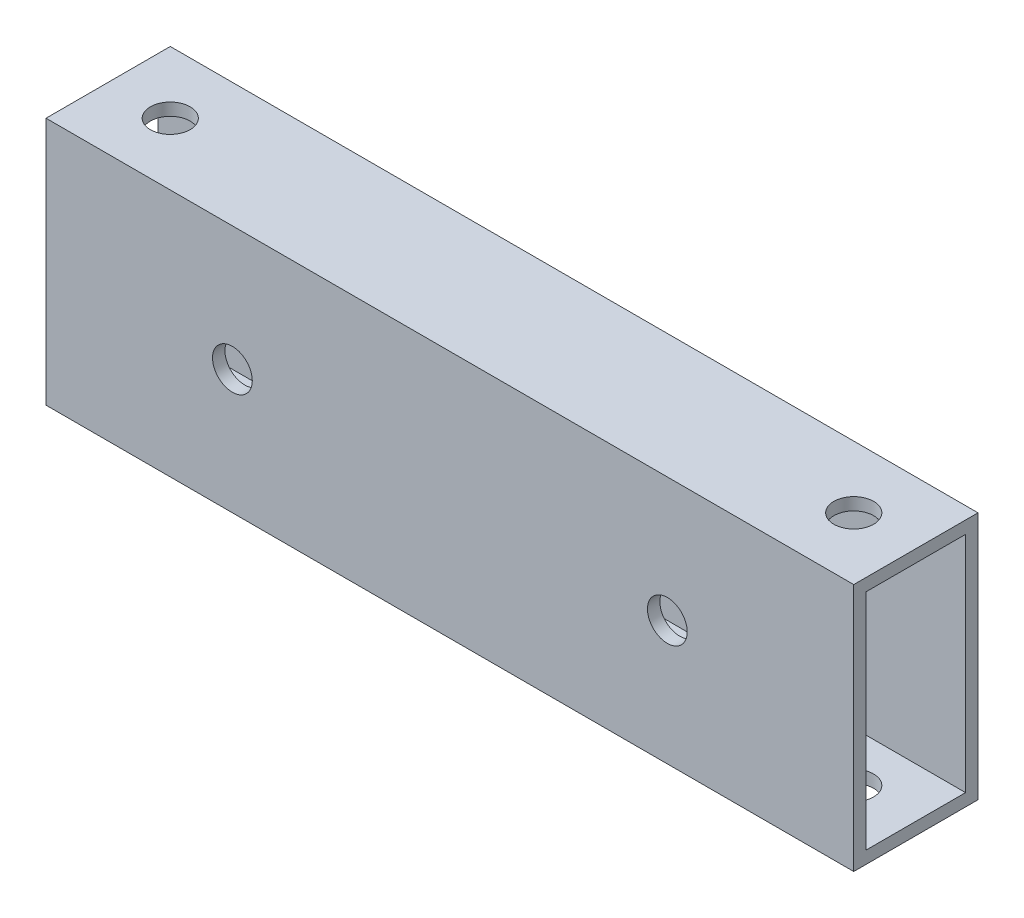
ISO-10303-21;
HEADER;
FILE_DESCRIPTION(('STEP AP214'),'2;1');
FILE_NAME('part.step','',(''),(''),'','','');
FILE_SCHEMA(('AUTOMOTIVE_DESIGN { 1 0 10303 214 1 1 1 1 }'));
ENDSEC;
DATA;
#1=APPLICATION_CONTEXT('core data for automotive mechanical design processes');
#2=APPLICATION_PROTOCOL_DEFINITION('international standard','automotive_design',2000,#1);
#3=PRODUCT_CONTEXT('',#1,'mechanical');
#4=PRODUCT('Part','Part','',(#3));
#5=PRODUCT_RELATED_PRODUCT_CATEGORY('part','',(#4));
#6=PRODUCT_DEFINITION_FORMATION('','',#4);
#7=PRODUCT_DEFINITION_CONTEXT('part definition',#1,'design');
#8=PRODUCT_DEFINITION('design','',#6,#7);
#9=PRODUCT_DEFINITION_SHAPE('','',#8);
#10=(LENGTH_UNIT() NAMED_UNIT(*) SI_UNIT(.MILLI.,.METRE.));
#11=(NAMED_UNIT(*) PLANE_ANGLE_UNIT() SI_UNIT($,.RADIAN.));
#12=(NAMED_UNIT(*) SI_UNIT($,.STERADIAN.) SOLID_ANGLE_UNIT());
#13=UNCERTAINTY_MEASURE_WITH_UNIT(LENGTH_MEASURE(1.E-05),#10,'distance_accuracy_value','');
#14=(GEOMETRIC_REPRESENTATION_CONTEXT(3) GLOBAL_UNCERTAINTY_ASSIGNED_CONTEXT((#13)) GLOBAL_UNIT_ASSIGNED_CONTEXT((#10,
#11,#12)) REPRESENTATION_CONTEXT('',''));
#15=CARTESIAN_POINT('',(0.,0.,0.));
#16=DIRECTION('',(0.,0.,1.));
#17=DIRECTION('',(1.,0.,0.));
#18=AXIS2_PLACEMENT_3D('',#15,#16,#17);
#19=CARTESIAN_POINT('',(65.,0.,0.));
#20=DIRECTION('',(1.,0.,0.));
#21=DIRECTION('',(0.,0.,-1.));
#22=AXIS2_PLACEMENT_3D('',#19,#20,#21);
#23=PLANE('',#22);
#24=DIRECTION('',(0.,1.,0.));
#25=VECTOR('',#24,1.);
#26=CARTESIAN_POINT('',(65.,10.,-5.));
#27=LINE('',#26,#25);
#28=CARTESIAN_POINT('',(65.,-10.,-5.));
#29=VERTEX_POINT('',#28);
#30=CARTESIAN_POINT('',(65.,10.,-5.));
#31=VERTEX_POINT('',#30);
#32=EDGE_CURVE('E161',#29,#31,#27,.T.);
#33=ORIENTED_EDGE('',*,*,#32,.T.);
#34=DIRECTION('',(0.,0.,1.));
#35=VECTOR('',#34,1.);
#36=CARTESIAN_POINT('',(65.,10.,5.));
#37=LINE('',#36,#35);
#38=CARTESIAN_POINT('',(65.,10.,5.));
#39=VERTEX_POINT('',#38);
#40=EDGE_CURVE('E164',#31,#39,#37,.T.);
#41=ORIENTED_EDGE('',*,*,#40,.T.);
#42=DIRECTION('',(0.,-1.,0.));
#43=VECTOR('',#42,1.);
#44=CARTESIAN_POINT('',(65.,10.,5.));
#45=LINE('',#44,#43);
#46=CARTESIAN_POINT('',(65.,-10.,5.));
#47=VERTEX_POINT('',#46);
#48=EDGE_CURVE('E167',#39,#47,#45,.T.);
#49=ORIENTED_EDGE('',*,*,#48,.T.);
#50=DIRECTION('',(0.,0.,-1.));
#51=VECTOR('',#50,1.);
#52=CARTESIAN_POINT('',(65.,-10.,5.));
#53=LINE('',#52,#51);
#54=EDGE_CURVE('E169',#47,#29,#53,.T.);
#55=ORIENTED_EDGE('',*,*,#54,.T.);
#56=EDGE_LOOP('',(#33,#41,#49,#55));
#57=FACE_BOUND('',#56,.T.);
#58=DIRECTION('',(0.,0.,1.));
#59=VECTOR('',#58,1.);
#60=CARTESIAN_POINT('',(65.,9.,5.));
#61=LINE('',#60,#59);
#62=CARTESIAN_POINT('',(65.,9.,-4.));
#63=VERTEX_POINT('',#62);
#64=CARTESIAN_POINT('',(65.,9.,4.));
#65=VERTEX_POINT('',#64);
#66=EDGE_CURVE('E131',#63,#65,#61,.T.);
#67=ORIENTED_EDGE('',*,*,#66,.F.);
#68=DIRECTION('',(0.,1.,0.));
#69=VECTOR('',#68,1.);
#70=CARTESIAN_POINT('',(65.,10.,-4.));
#71=LINE('',#70,#69);
#72=CARTESIAN_POINT('',(65.,-9.,-4.));
#73=VERTEX_POINT('',#72);
#74=EDGE_CURVE('E123',#73,#63,#71,.T.);
#75=ORIENTED_EDGE('',*,*,#74,.F.);
#76=DIRECTION('',(0.,0.,-1.));
#77=VECTOR('',#76,1.);
#78=CARTESIAN_POINT('',(65.,-9.,5.));
#79=LINE('',#78,#77);
#80=CARTESIAN_POINT('',(65.,-9.,4.));
#81=VERTEX_POINT('',#80);
#82=EDGE_CURVE('E145',#81,#73,#79,.T.);
#83=ORIENTED_EDGE('',*,*,#82,.F.);
#84=DIRECTION('',(0.,-1.,0.));
#85=VECTOR('',#84,1.);
#86=CARTESIAN_POINT('',(65.,10.,4.));
#87=LINE('',#86,#85);
#88=EDGE_CURVE('E143',#65,#81,#87,.T.);
#89=ORIENTED_EDGE('',*,*,#88,.F.);
#90=EDGE_LOOP('',(#67,#75,#83,#89));
#91=FACE_BOUND('',#90,.T.);
#92=ADVANCED_FACE('F56',(#57,#91),#23,.T.);
#93=CARTESIAN_POINT('',(0.,0.,0.));
#94=DIRECTION('',(1.,0.,0.));
#95=DIRECTION('',(0.,0.,-1.));
#96=AXIS2_PLACEMENT_3D('',#93,#94,#95);
#97=PLANE('',#96);
#98=DIRECTION('',(0.,1.,0.));
#99=VECTOR('',#98,1.);
#100=CARTESIAN_POINT('',(0.,10.,-5.));
#101=LINE('',#100,#99);
#102=CARTESIAN_POINT('',(0.,-10.,-5.));
#103=VERTEX_POINT('',#102);
#104=CARTESIAN_POINT('',(0.,10.,-5.));
#105=VERTEX_POINT('',#104);
#106=EDGE_CURVE('E139',#103,#105,#101,.T.);
#107=ORIENTED_EDGE('',*,*,#106,.F.);
#108=DIRECTION('',(0.,0.,-1.));
#109=VECTOR('',#108,1.);
#110=CARTESIAN_POINT('',(0.,-10.,5.));
#111=LINE('',#110,#109);
#112=CARTESIAN_POINT('',(0.,-10.,5.));
#113=VERTEX_POINT('',#112);
#114=EDGE_CURVE('E165',#113,#103,#111,.T.);
#115=ORIENTED_EDGE('',*,*,#114,.F.);
#116=DIRECTION('',(0.,-1.,0.));
#117=VECTOR('',#116,1.);
#118=CARTESIAN_POINT('',(0.,10.,5.));
#119=LINE('',#118,#117);
#120=CARTESIAN_POINT('',(0.,10.,5.));
#121=VERTEX_POINT('',#120);
#122=EDGE_CURVE('E176',#121,#113,#119,.T.);
#123=ORIENTED_EDGE('',*,*,#122,.F.);
#124=DIRECTION('',(0.,0.,1.));
#125=VECTOR('',#124,1.);
#126=CARTESIAN_POINT('',(0.,10.,5.));
#127=LINE('',#126,#125);
#128=EDGE_CURVE('E174',#105,#121,#127,.T.);
#129=ORIENTED_EDGE('',*,*,#128,.F.);
#130=EDGE_LOOP('',(#107,#115,#123,#129));
#131=FACE_BOUND('',#130,.T.);
#132=DIRECTION('',(0.,1.,0.));
#133=VECTOR('',#132,1.);
#134=CARTESIAN_POINT('',(0.,10.,-4.));
#135=LINE('',#134,#133);
#136=CARTESIAN_POINT('',(0.,-9.,-4.));
#137=VERTEX_POINT('',#136);
#138=CARTESIAN_POINT('',(0.,9.,-4.));
#139=VERTEX_POINT('',#138);
#140=EDGE_CURVE('E81',#137,#139,#135,.T.);
#141=ORIENTED_EDGE('',*,*,#140,.T.);
#142=DIRECTION('',(0.,0.,1.));
#143=VECTOR('',#142,1.);
#144=CARTESIAN_POINT('',(0.,9.,5.));
#145=LINE('',#144,#143);
#146=CARTESIAN_POINT('',(0.,9.,4.));
#147=VERTEX_POINT('',#146);
#148=EDGE_CURVE('E138',#139,#147,#145,.T.);
#149=ORIENTED_EDGE('',*,*,#148,.T.);
#150=DIRECTION('',(0.,-1.,0.));
#151=VECTOR('',#150,1.);
#152=CARTESIAN_POINT('',(0.,10.,4.));
#153=LINE('',#152,#151);
#154=CARTESIAN_POINT('',(0.,-9.,4.));
#155=VERTEX_POINT('',#154);
#156=EDGE_CURVE('E153',#147,#155,#153,.T.);
#157=ORIENTED_EDGE('',*,*,#156,.T.);
#158=DIRECTION('',(0.,0.,-1.));
#159=VECTOR('',#158,1.);
#160=CARTESIAN_POINT('',(0.,-9.,5.));
#161=LINE('',#160,#159);
#162=EDGE_CURVE('E132',#155,#137,#161,.T.);
#163=ORIENTED_EDGE('',*,*,#162,.T.);
#164=EDGE_LOOP('',(#141,#149,#157,#163));
#165=FACE_BOUND('',#164,.T.);
#166=ADVANCED_FACE('F253',(#131,#165),#97,.F.);
#167=CARTESIAN_POINT('',(65.,10.,-5.));
#168=DIRECTION('',(0.,0.,1.));
#169=DIRECTION('',(0.,-1.,0.));
#170=AXIS2_PLACEMENT_3D('',#167,#168,#169);
#171=PLANE('',#170);
#172=CARTESIAN_POINT('',(15.,0.,-5.));
#173=DIRECTION('',(0.,0.,1.));
#174=DIRECTION('',(1.,0.,0.));
#175=AXIS2_PLACEMENT_3D('',#172,#173,#174);
#176=CIRCLE('',#175,1.6);
#177=CARTESIAN_POINT('',(16.6,0.,-5.));
#178=VERTEX_POINT('',#177);
#179=EDGE_CURVE('E190',#178,#178,#176,.T.);
#180=ORIENTED_EDGE('',*,*,#179,.T.);
#181=EDGE_LOOP('',(#180));
#182=FACE_BOUND('',#181,.T.);
#183=CARTESIAN_POINT('',(50.,0.,-5.));
#184=DIRECTION('',(0.,0.,1.));
#185=DIRECTION('',(-1.,0.,0.));
#186=AXIS2_PLACEMENT_3D('',#183,#184,#185);
#187=CIRCLE('',#186,1.60000000000001);
#188=CARTESIAN_POINT('',(48.4,0.,-5.));
#189=VERTEX_POINT('',#188);
#190=EDGE_CURVE('E224',#189,#189,#187,.T.);
#191=ORIENTED_EDGE('',*,*,#190,.T.);
#192=EDGE_LOOP('',(#191));
#193=FACE_BOUND('',#192,.T.);
#194=ORIENTED_EDGE('',*,*,#106,.T.);
#195=DIRECTION('',(-1.,0.,0.));
#196=VECTOR('',#195,1.);
#197=CARTESIAN_POINT('',(65.,10.,-5.));
#198=LINE('',#197,#196);
#199=EDGE_CURVE('E12',#31,#105,#198,.T.);
#200=ORIENTED_EDGE('',*,*,#199,.F.);
#201=ORIENTED_EDGE('',*,*,#32,.F.);
#202=DIRECTION('',(-1.,0.,0.));
#203=VECTOR('',#202,1.);
#204=CARTESIAN_POINT('',(65.,-10.,-5.));
#205=LINE('',#204,#203);
#206=EDGE_CURVE('E171',#29,#103,#205,.T.);
#207=ORIENTED_EDGE('',*,*,#206,.T.);
#208=EDGE_LOOP('',(#194,#200,#201,#207));
#209=FACE_BOUND('',#208,.T.);
#210=ADVANCED_FACE('F58',(#182,#193,#209),#171,.F.);
#211=CARTESIAN_POINT('',(65.,10.,5.));
#212=DIRECTION('',(0.,-1.,0.));
#213=DIRECTION('',(0.,0.,-1.));
#214=AXIS2_PLACEMENT_3D('',#211,#212,#213);
#215=PLANE('',#214);
#216=CARTESIAN_POINT('',(5.,10.,0.));
#217=DIRECTION('',(0.,1.,0.));
#218=DIRECTION('',(0.,0.,1.));
#219=AXIS2_PLACEMENT_3D('',#216,#217,#218);
#220=CIRCLE('',#219,1.6);
#221=CARTESIAN_POINT('',(5.,10.,1.60000000000001));
#222=VERTEX_POINT('',#221);
#223=EDGE_CURVE('E202',#222,#222,#220,.T.);
#224=ORIENTED_EDGE('',*,*,#223,.F.);
#225=EDGE_LOOP('',(#224));
#226=FACE_BOUND('',#225,.T.);
#227=CARTESIAN_POINT('',(60.,10.,0.));
#228=DIRECTION('',(0.,1.,0.));
#229=DIRECTION('',(0.,0.,-1.));
#230=AXIS2_PLACEMENT_3D('',#227,#228,#229);
#231=CIRCLE('',#230,1.6);
#232=CARTESIAN_POINT('',(60.,10.,-1.6));
#233=VERTEX_POINT('',#232);
#234=EDGE_CURVE('E212',#233,#233,#231,.T.);
#235=ORIENTED_EDGE('',*,*,#234,.F.);
#236=EDGE_LOOP('',(#235));
#237=FACE_BOUND('',#236,.T.);
#238=ORIENTED_EDGE('',*,*,#128,.T.);
#239=DIRECTION('',(-1.,0.,0.));
#240=VECTOR('',#239,1.);
#241=CARTESIAN_POINT('',(65.,10.,5.));
#242=LINE('',#241,#240);
#243=EDGE_CURVE('E65',#39,#121,#242,.T.);
#244=ORIENTED_EDGE('',*,*,#243,.F.);
#245=ORIENTED_EDGE('',*,*,#40,.F.);
#246=ORIENTED_EDGE('',*,*,#199,.T.);
#247=EDGE_LOOP('',(#238,#244,#245,#246));
#248=FACE_BOUND('',#247,.T.);
#249=ADVANCED_FACE('F252',(#226,#237,#248),#215,.F.);
#250=CARTESIAN_POINT('',(65.,10.,5.));
#251=DIRECTION('',(0.,0.,-1.));
#252=DIRECTION('',(0.,1.,0.));
#253=AXIS2_PLACEMENT_3D('',#250,#251,#252);
#254=PLANE('',#253);
#255=CARTESIAN_POINT('',(15.,0.,5.));
#256=DIRECTION('',(0.,0.,1.));
#257=DIRECTION('',(1.,0.,0.));
#258=AXIS2_PLACEMENT_3D('',#255,#256,#257);
#259=CIRCLE('',#258,1.6);
#260=CARTESIAN_POINT('',(16.6,0.,5.));
#261=VERTEX_POINT('',#260);
#262=EDGE_CURVE('E221',#261,#261,#259,.T.);
#263=ORIENTED_EDGE('',*,*,#262,.F.);
#264=EDGE_LOOP('',(#263));
#265=FACE_BOUND('',#264,.T.);
#266=CARTESIAN_POINT('',(50.,0.,5.));
#267=DIRECTION('',(0.,0.,1.));
#268=DIRECTION('',(-1.,0.,0.));
#269=AXIS2_PLACEMENT_3D('',#266,#267,#268);
#270=CIRCLE('',#269,1.60000000000001);
#271=CARTESIAN_POINT('',(48.4,0.,5.));
#272=VERTEX_POINT('',#271);
#273=EDGE_CURVE('E218',#272,#272,#270,.T.);
#274=ORIENTED_EDGE('',*,*,#273,.F.);
#275=EDGE_LOOP('',(#274));
#276=FACE_BOUND('',#275,.T.);
#277=ORIENTED_EDGE('',*,*,#122,.T.);
#278=DIRECTION('',(-1.,0.,0.));
#279=VECTOR('',#278,1.);
#280=CARTESIAN_POINT('',(65.,-10.,5.));
#281=LINE('',#280,#279);
#282=EDGE_CURVE('E181',#47,#113,#281,.T.);
#283=ORIENTED_EDGE('',*,*,#282,.F.);
#284=ORIENTED_EDGE('',*,*,#48,.F.);
#285=ORIENTED_EDGE('',*,*,#243,.T.);
#286=EDGE_LOOP('',(#277,#283,#284,#285));
#287=FACE_BOUND('',#286,.T.);
#288=ADVANCED_FACE('F271',(#265,#276,#287),#254,.F.);
#289=CARTESIAN_POINT('',(65.,-10.,5.));
#290=DIRECTION('',(0.,1.,0.));
#291=DIRECTION('',(0.,0.,1.));
#292=AXIS2_PLACEMENT_3D('',#289,#290,#291);
#293=PLANE('',#292);
#294=CARTESIAN_POINT('',(5.,-10.,0.));
#295=DIRECTION('',(0.,1.,0.));
#296=DIRECTION('',(0.,0.,1.));
#297=AXIS2_PLACEMENT_3D('',#294,#295,#296);
#298=CIRCLE('',#297,1.6);
#299=CARTESIAN_POINT('',(5.,-10.,1.60000000000001));
#300=VERTEX_POINT('',#299);
#301=EDGE_CURVE('E196',#300,#300,#298,.T.);
#302=ORIENTED_EDGE('',*,*,#301,.T.);
#303=EDGE_LOOP('',(#302));
#304=FACE_BOUND('',#303,.T.);
#305=CARTESIAN_POINT('',(60.,-10.,0.));
#306=DIRECTION('',(0.,1.,0.));
#307=DIRECTION('',(0.,0.,-1.));
#308=AXIS2_PLACEMENT_3D('',#305,#306,#307);
#309=CIRCLE('',#308,1.6);
#310=CARTESIAN_POINT('',(60.,-10.,-1.6));
#311=VERTEX_POINT('',#310);
#312=EDGE_CURVE('E207',#311,#311,#309,.T.);
#313=ORIENTED_EDGE('',*,*,#312,.T.);
#314=EDGE_LOOP('',(#313));
#315=FACE_BOUND('',#314,.T.);
#316=ORIENTED_EDGE('',*,*,#114,.T.);
#317=ORIENTED_EDGE('',*,*,#206,.F.);
#318=ORIENTED_EDGE('',*,*,#54,.F.);
#319=ORIENTED_EDGE('',*,*,#282,.T.);
#320=EDGE_LOOP('',(#316,#317,#318,#319));
#321=FACE_BOUND('',#320,.T.);
#322=ADVANCED_FACE('F238',(#304,#315,#321),#293,.F.);
#323=CARTESIAN_POINT('',(65.,10.,-4.));
#324=DIRECTION('',(0.,0.,1.));
#325=DIRECTION('',(0.,-1.,0.));
#326=AXIS2_PLACEMENT_3D('',#323,#324,#325);
#327=PLANE('',#326);
#328=CARTESIAN_POINT('',(15.,0.,-4.));
#329=DIRECTION('',(0.,0.,1.));
#330=DIRECTION('',(0.,-1.,0.));
#331=AXIS2_PLACEMENT_3D('',#328,#329,#330);
#332=CIRCLE('',#331,1.6);
#333=CARTESIAN_POINT('',(15.,-1.60000000000001,-4.));
#334=VERTEX_POINT('',#333);
#335=EDGE_CURVE('E151',#334,#334,#332,.T.);
#336=ORIENTED_EDGE('',*,*,#335,.F.);
#337=EDGE_LOOP('',(#336));
#338=FACE_BOUND('',#337,.T.);
#339=CARTESIAN_POINT('',(50.,0.,-4.));
#340=DIRECTION('',(0.,0.,1.));
#341=DIRECTION('',(0.,-1.,0.));
#342=AXIS2_PLACEMENT_3D('',#339,#340,#341);
#343=CIRCLE('',#342,1.60000000000001);
#344=CARTESIAN_POINT('',(50.,-1.6,-4.));
#345=VERTEX_POINT('',#344);
#346=EDGE_CURVE('E189',#345,#345,#343,.T.);
#347=ORIENTED_EDGE('',*,*,#346,.F.);
#348=EDGE_LOOP('',(#347));
#349=FACE_BOUND('',#348,.T.);
#350=ORIENTED_EDGE('',*,*,#140,.F.);
#351=DIRECTION('',(-1.,0.,0.));
#352=VECTOR('',#351,1.);
#353=CARTESIAN_POINT('',(65.,-9.,-4.));
#354=LINE('',#353,#352);
#355=EDGE_CURVE('E127',#73,#137,#354,.T.);
#356=ORIENTED_EDGE('',*,*,#355,.F.);
#357=ORIENTED_EDGE('',*,*,#74,.T.);
#358=DIRECTION('',(-1.,0.,0.));
#359=VECTOR('',#358,1.);
#360=CARTESIAN_POINT('',(65.,9.,-4.));
#361=LINE('',#360,#359);
#362=EDGE_CURVE('E126',#63,#139,#361,.T.);
#363=ORIENTED_EDGE('',*,*,#362,.T.);
#364=EDGE_LOOP('',(#350,#356,#357,#363));
#365=FACE_BOUND('',#364,.T.);
#366=ADVANCED_FACE('F125',(#338,#349,#365),#327,.T.);
#367=CARTESIAN_POINT('',(65.,9.,5.));
#368=DIRECTION('',(0.,-1.,0.));
#369=DIRECTION('',(0.,0.,-1.));
#370=AXIS2_PLACEMENT_3D('',#367,#368,#369);
#371=PLANE('',#370);
#372=CARTESIAN_POINT('',(5.,9.,0.));
#373=DIRECTION('',(0.,-1.,0.));
#374=DIRECTION('',(0.,0.,-1.));
#375=AXIS2_PLACEMENT_3D('',#372,#373,#374);
#376=CIRCLE('',#375,1.6);
#377=CARTESIAN_POINT('',(5.,9.,-1.6));
#378=VERTEX_POINT('',#377);
#379=EDGE_CURVE('E215',#378,#378,#376,.T.);
#380=ORIENTED_EDGE('',*,*,#379,.F.);
#381=EDGE_LOOP('',(#380));
#382=FACE_BOUND('',#381,.T.);
#383=CARTESIAN_POINT('',(60.,9.,0.));
#384=DIRECTION('',(0.,-1.,0.));
#385=DIRECTION('',(0.,0.,-1.));
#386=AXIS2_PLACEMENT_3D('',#383,#384,#385);
#387=CIRCLE('',#386,1.6);
#388=CARTESIAN_POINT('',(60.,9.,-1.6));
#389=VERTEX_POINT('',#388);
#390=EDGE_CURVE('E195',#389,#389,#387,.T.);
#391=ORIENTED_EDGE('',*,*,#390,.F.);
#392=EDGE_LOOP('',(#391));
#393=FACE_BOUND('',#392,.T.);
#394=ORIENTED_EDGE('',*,*,#148,.F.);
#395=ORIENTED_EDGE('',*,*,#362,.F.);
#396=ORIENTED_EDGE('',*,*,#66,.T.);
#397=DIRECTION('',(-1.,0.,0.));
#398=VECTOR('',#397,1.);
#399=CARTESIAN_POINT('',(65.,9.,4.));
#400=LINE('',#399,#398);
#401=EDGE_CURVE('E140',#65,#147,#400,.T.);
#402=ORIENTED_EDGE('',*,*,#401,.T.);
#403=EDGE_LOOP('',(#394,#395,#396,#402));
#404=FACE_BOUND('',#403,.T.);
#405=ADVANCED_FACE('F135',(#382,#393,#404),#371,.T.);
#406=CARTESIAN_POINT('',(65.,10.,4.));
#407=DIRECTION('',(0.,0.,-1.));
#408=DIRECTION('',(0.,1.,0.));
#409=AXIS2_PLACEMENT_3D('',#406,#407,#408);
#410=PLANE('',#409);
#411=CARTESIAN_POINT('',(15.,0.,4.));
#412=DIRECTION('',(0.,0.,-1.));
#413=DIRECTION('',(0.,1.,0.));
#414=AXIS2_PLACEMENT_3D('',#411,#412,#413);
#415=CIRCLE('',#414,1.6);
#416=CARTESIAN_POINT('',(15.,1.6,4.));
#417=VERTEX_POINT('',#416);
#418=EDGE_CURVE('E191',#417,#417,#415,.T.);
#419=ORIENTED_EDGE('',*,*,#418,.F.);
#420=EDGE_LOOP('',(#419));
#421=FACE_BOUND('',#420,.T.);
#422=CARTESIAN_POINT('',(50.,0.,4.));
#423=DIRECTION('',(0.,0.,-1.));
#424=DIRECTION('',(0.,1.,0.));
#425=AXIS2_PLACEMENT_3D('',#422,#423,#424);
#426=CIRCLE('',#425,1.60000000000001);
#427=CARTESIAN_POINT('',(50.,1.60000000000001,4.));
#428=VERTEX_POINT('',#427);
#429=EDGE_CURVE('E186',#428,#428,#426,.T.);
#430=ORIENTED_EDGE('',*,*,#429,.F.);
#431=EDGE_LOOP('',(#430));
#432=FACE_BOUND('',#431,.T.);
#433=ORIENTED_EDGE('',*,*,#156,.F.);
#434=ORIENTED_EDGE('',*,*,#401,.F.);
#435=ORIENTED_EDGE('',*,*,#88,.T.);
#436=DIRECTION('',(-1.,0.,0.));
#437=VECTOR('',#436,1.);
#438=CARTESIAN_POINT('',(65.,-9.,4.));
#439=LINE('',#438,#437);
#440=EDGE_CURVE('E73',#81,#155,#439,.T.);
#441=ORIENTED_EDGE('',*,*,#440,.T.);
#442=EDGE_LOOP('',(#433,#434,#435,#441));
#443=FACE_BOUND('',#442,.T.);
#444=ADVANCED_FACE('F292',(#421,#432,#443),#410,.T.);
#445=CARTESIAN_POINT('',(65.,-9.,5.));
#446=DIRECTION('',(0.,1.,0.));
#447=DIRECTION('',(0.,0.,1.));
#448=AXIS2_PLACEMENT_3D('',#445,#446,#447);
#449=PLANE('',#448);
#450=CARTESIAN_POINT('',(5.,-9.,0.));
#451=DIRECTION('',(0.,1.,0.));
#452=DIRECTION('',(0.,0.,1.));
#453=AXIS2_PLACEMENT_3D('',#450,#451,#452);
#454=CIRCLE('',#453,1.6);
#455=CARTESIAN_POINT('',(5.,-9.,1.60000000000001));
#456=VERTEX_POINT('',#455);
#457=EDGE_CURVE('E60',#456,#456,#454,.T.);
#458=ORIENTED_EDGE('',*,*,#457,.F.);
#459=EDGE_LOOP('',(#458));
#460=FACE_BOUND('',#459,.T.);
#461=CARTESIAN_POINT('',(60.,-9.,0.));
#462=DIRECTION('',(0.,1.,0.));
#463=DIRECTION('',(0.,0.,1.));
#464=AXIS2_PLACEMENT_3D('',#461,#462,#463);
#465=CIRCLE('',#464,1.6);
#466=CARTESIAN_POINT('',(60.,-9.,1.59999999999999));
#467=VERTEX_POINT('',#466);
#468=EDGE_CURVE('E193',#467,#467,#465,.T.);
#469=ORIENTED_EDGE('',*,*,#468,.F.);
#470=EDGE_LOOP('',(#469));
#471=FACE_BOUND('',#470,.T.);
#472=ORIENTED_EDGE('',*,*,#162,.F.);
#473=ORIENTED_EDGE('',*,*,#440,.F.);
#474=ORIENTED_EDGE('',*,*,#82,.T.);
#475=ORIENTED_EDGE('',*,*,#355,.T.);
#476=EDGE_LOOP('',(#472,#473,#474,#475));
#477=FACE_BOUND('',#476,.T.);
#478=ADVANCED_FACE('F296',(#460,#471,#477),#449,.T.);
#479=CARTESIAN_POINT('',(50.,0.,-5.));
#480=DIRECTION('',(0.,0.,1.));
#481=DIRECTION('',(1.,0.,0.));
#482=AXIS2_PLACEMENT_3D('',#479,#480,#481);
#483=CYLINDRICAL_SURFACE('',#482,1.60000000000001);
#484=ORIENTED_EDGE('',*,*,#429,.T.);
#485=EDGE_LOOP('',(#484));
#486=FACE_BOUND('',#485,.T.);
#487=ORIENTED_EDGE('',*,*,#273,.T.);
#488=EDGE_LOOP('',(#487));
#489=FACE_BOUND('',#488,.T.);
#490=ADVANCED_FACE('F247',(#486,#489),#483,.F.);
#491=CARTESIAN_POINT('',(15.,0.,-5.));
#492=DIRECTION('',(0.,0.,1.));
#493=DIRECTION('',(1.,0.,0.));
#494=AXIS2_PLACEMENT_3D('',#491,#492,#493);
#495=CYLINDRICAL_SURFACE('',#494,1.6);
#496=ORIENTED_EDGE('',*,*,#418,.T.);
#497=EDGE_LOOP('',(#496));
#498=FACE_BOUND('',#497,.T.);
#499=ORIENTED_EDGE('',*,*,#262,.T.);
#500=EDGE_LOOP('',(#499));
#501=FACE_BOUND('',#500,.T.);
#502=ADVANCED_FACE('F245',(#498,#501),#495,.F.);
#503=ORIENTED_EDGE('',*,*,#346,.T.);
#504=EDGE_LOOP('',(#503));
#505=FACE_BOUND('',#504,.T.);
#506=ORIENTED_EDGE('',*,*,#190,.F.);
#507=EDGE_LOOP('',(#506));
#508=FACE_BOUND('',#507,.T.);
#509=ADVANCED_FACE('F242',(#505,#508),#483,.F.);
#510=ORIENTED_EDGE('',*,*,#335,.T.);
#511=EDGE_LOOP('',(#510));
#512=FACE_BOUND('',#511,.T.);
#513=ORIENTED_EDGE('',*,*,#179,.F.);
#514=EDGE_LOOP('',(#513));
#515=FACE_BOUND('',#514,.T.);
#516=ADVANCED_FACE('F233',(#512,#515),#495,.F.);
#517=CARTESIAN_POINT('',(60.,-10.,0.));
#518=DIRECTION('',(0.,1.,0.));
#519=DIRECTION('',(0.,0.,1.));
#520=AXIS2_PLACEMENT_3D('',#517,#518,#519);
#521=CYLINDRICAL_SURFACE('',#520,1.6);
#522=ORIENTED_EDGE('',*,*,#468,.T.);
#523=EDGE_LOOP('',(#522));
#524=FACE_BOUND('',#523,.T.);
#525=ORIENTED_EDGE('',*,*,#312,.F.);
#526=EDGE_LOOP('',(#525));
#527=FACE_BOUND('',#526,.T.);
#528=ADVANCED_FACE('F306',(#524,#527),#521,.F.);
#529=CARTESIAN_POINT('',(5.,-10.,0.));
#530=DIRECTION('',(0.,1.,0.));
#531=DIRECTION('',(0.,0.,1.));
#532=AXIS2_PLACEMENT_3D('',#529,#530,#531);
#533=CYLINDRICAL_SURFACE('',#532,1.6);
#534=ORIENTED_EDGE('',*,*,#457,.T.);
#535=EDGE_LOOP('',(#534));
#536=FACE_BOUND('',#535,.T.);
#537=ORIENTED_EDGE('',*,*,#301,.F.);
#538=EDGE_LOOP('',(#537));
#539=FACE_BOUND('',#538,.T.);
#540=ADVANCED_FACE('F309',(#536,#539),#533,.F.);
#541=ORIENTED_EDGE('',*,*,#390,.T.);
#542=EDGE_LOOP('',(#541));
#543=FACE_BOUND('',#542,.T.);
#544=ORIENTED_EDGE('',*,*,#234,.T.);
#545=EDGE_LOOP('',(#544));
#546=FACE_BOUND('',#545,.T.);
#547=ADVANCED_FACE('F310',(#543,#546),#521,.F.);
#548=ORIENTED_EDGE('',*,*,#379,.T.);
#549=EDGE_LOOP('',(#548));
#550=FACE_BOUND('',#549,.T.);
#551=ORIENTED_EDGE('',*,*,#223,.T.);
#552=EDGE_LOOP('',(#551));
#553=FACE_BOUND('',#552,.T.);
#554=ADVANCED_FACE('F313',(#550,#553),#533,.F.);
#555=CLOSED_SHELL('',(#92,#166,#210,#249,#288,#322,#366,#405,#444,#478,#490,#502,#509,#516,#528,
#540,#547,#554));
#556=MANIFOLD_SOLID_BREP('B2',#555);
#557=ADVANCED_BREP_SHAPE_REPRESENTATION('',(#18,#556),#14);
#558=SHAPE_DEFINITION_REPRESENTATION(#9,#557);
ENDSEC;
END-ISO-10303-21;
